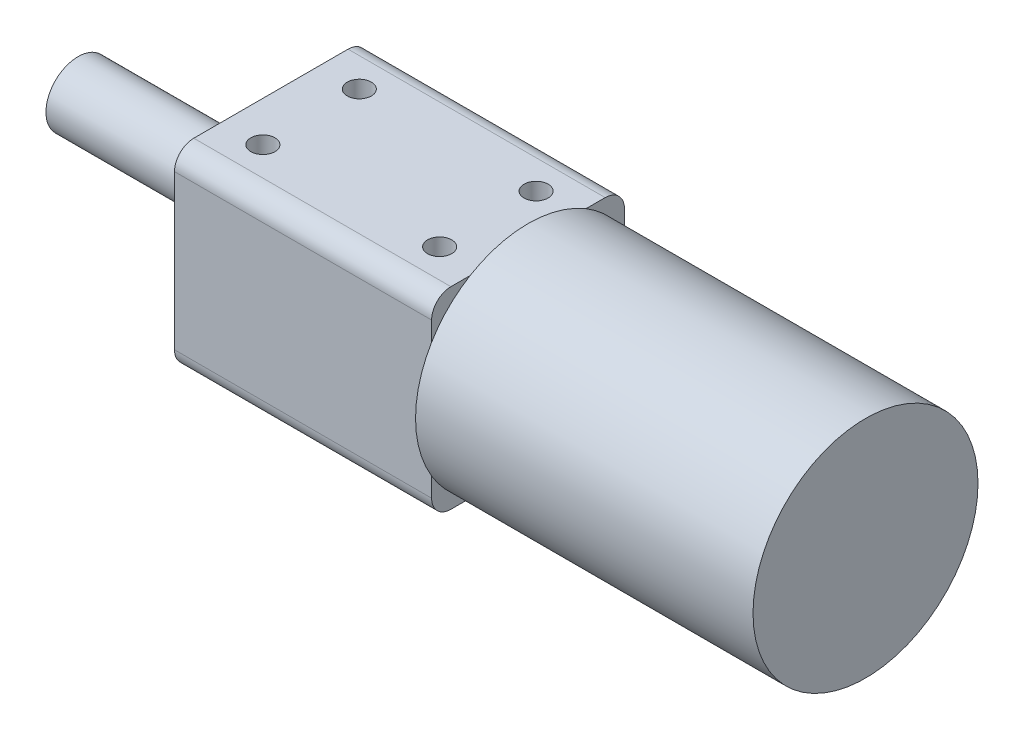
ISO-10303-21;
HEADER;
FILE_DESCRIPTION(('STEP AP214'),'2;1');
FILE_NAME('part.step','',(''),(''),'','','');
FILE_SCHEMA(('AUTOMOTIVE_DESIGN { 1 0 10303 214 1 1 1 1 }'));
ENDSEC;
DATA;
#1=APPLICATION_CONTEXT('core data for automotive mechanical design processes');
#2=APPLICATION_PROTOCOL_DEFINITION('international standard','automotive_design',2000,#1);
#3=PRODUCT_CONTEXT('',#1,'mechanical');
#4=PRODUCT('Part','Part','',(#3));
#5=PRODUCT_RELATED_PRODUCT_CATEGORY('part','',(#4));
#6=PRODUCT_DEFINITION_FORMATION('','',#4);
#7=PRODUCT_DEFINITION_CONTEXT('part definition',#1,'design');
#8=PRODUCT_DEFINITION('design','',#6,#7);
#9=PRODUCT_DEFINITION_SHAPE('','',#8);
#10=(LENGTH_UNIT() NAMED_UNIT(*) SI_UNIT(.MILLI.,.METRE.));
#11=(NAMED_UNIT(*) PLANE_ANGLE_UNIT() SI_UNIT($,.RADIAN.));
#12=(NAMED_UNIT(*) SI_UNIT($,.STERADIAN.) SOLID_ANGLE_UNIT());
#13=UNCERTAINTY_MEASURE_WITH_UNIT(LENGTH_MEASURE(1.E-05),#10,'distance_accuracy_value','');
#14=(GEOMETRIC_REPRESENTATION_CONTEXT(3) GLOBAL_UNCERTAINTY_ASSIGNED_CONTEXT((#13)) GLOBAL_UNIT_ASSIGNED_CONTEXT((#10,
#11,#12)) REPRESENTATION_CONTEXT('',''));
#15=CARTESIAN_POINT('',(0.,0.,0.));
#16=DIRECTION('',(0.,0.,1.));
#17=DIRECTION('',(1.,0.,0.));
#18=AXIS2_PLACEMENT_3D('',#15,#16,#17);
#19=CARTESIAN_POINT('',(0.,0.,0.));
#20=DIRECTION('',(1.,0.,0.));
#21=DIRECTION('',(0.,0.,-1.));
#22=AXIS2_PLACEMENT_3D('',#19,#20,#21);
#23=PLANE('',#22);
#24=DIRECTION('',(0.,0.,-1.));
#25=VECTOR('',#24,1.);
#26=CARTESIAN_POINT('',(0.,19.05,0.));
#27=LINE('',#26,#25);
#28=CARTESIAN_POINT('',(0.,19.05,11.4476252995982));
#29=VERTEX_POINT('',#28);
#30=CARTESIAN_POINT('',(0.,19.05,-11.4476252995982));
#31=VERTEX_POINT('',#30);
#32=EDGE_CURVE('E132',#29,#31,#27,.T.);
#33=ORIENTED_EDGE('',*,*,#32,.F.);
#34=CARTESIAN_POINT('',(0.,0.,0.));
#35=DIRECTION('',(1.,0.,0.));
#36=DIRECTION('',(0.,0.,-1.));
#37=AXIS2_PLACEMENT_3D('',#34,#35,#36);
#38=CIRCLE('',#37,22.225);
#39=EDGE_CURVE('E147',#31,#29,#38,.T.);
#40=ORIENTED_EDGE('',*,*,#39,.F.);
#41=EDGE_LOOP('',(#33,#40));
#42=FACE_BOUND('',#41,.T.);
#43=ADVANCED_FACE('F39',(#42),#23,.F.);
#44=DIRECTION('',(0.,1.,0.));
#45=VECTOR('',#44,1.);
#46=CARTESIAN_POINT('',(0.,0.,19.05));
#47=LINE('',#46,#45);
#48=CARTESIAN_POINT('',(0.,-11.4476252995982,19.05));
#49=VERTEX_POINT('',#48);
#50=CARTESIAN_POINT('',(0.,11.4476252995982,19.05));
#51=VERTEX_POINT('',#50);
#52=EDGE_CURVE('E153',#49,#51,#47,.T.);
#53=ORIENTED_EDGE('',*,*,#52,.F.);
#54=EDGE_CURVE('E148',#51,#49,#38,.T.);
#55=ORIENTED_EDGE('',*,*,#54,.F.);
#56=EDGE_LOOP('',(#53,#55));
#57=FACE_BOUND('',#56,.T.);
#58=ADVANCED_FACE('F216',(#57),#23,.F.);
#59=CARTESIAN_POINT('',(0.,-19.05,11.4476252995982));
#60=VERTEX_POINT('',#59);
#61=CARTESIAN_POINT('',(0.,-19.05,-11.4476252995982));
#62=VERTEX_POINT('',#61);
#63=EDGE_CURVE('E248',#60,#62,#38,.T.);
#64=ORIENTED_EDGE('',*,*,#63,.F.);
#65=DIRECTION('',(0.,0.,-1.));
#66=VECTOR('',#65,1.);
#67=CARTESIAN_POINT('',(0.,-19.05,0.));
#68=LINE('',#67,#66);
#69=EDGE_CURVE('E251',#60,#62,#68,.T.);
#70=ORIENTED_EDGE('',*,*,#69,.T.);
#71=EDGE_LOOP('',(#64,#70));
#72=FACE_BOUND('',#71,.T.);
#73=ADVANCED_FACE('F222',(#72),#23,.F.);
#74=CARTESIAN_POINT('',(66.675,0.,0.));
#75=DIRECTION('',(-1.,0.,0.));
#76=DIRECTION('',(0.,0.,1.));
#77=AXIS2_PLACEMENT_3D('',#74,#75,#76);
#78=CYLINDRICAL_SURFACE('',#77,22.225);
#79=CARTESIAN_POINT('',(66.675,0.,0.));
#80=DIRECTION('',(1.,0.,0.));
#81=DIRECTION('',(0.,0.,-1.));
#82=AXIS2_PLACEMENT_3D('',#79,#80,#81);
#83=CIRCLE('',#82,22.225);
#84=CARTESIAN_POINT('',(66.675,0.,-22.225));
#85=VERTEX_POINT('',#84);
#86=EDGE_CURVE('E158',#85,#85,#83,.T.);
#87=ORIENTED_EDGE('',*,*,#86,.F.);
#88=EDGE_LOOP('',(#87));
#89=FACE_BOUND('',#88,.T.);
#90=CARTESIAN_POINT('',(0.,11.4476252995982,-19.05));
#91=VERTEX_POINT('',#90);
#92=EDGE_CURVE('E157',#91,#31,#38,.T.);
#93=ORIENTED_EDGE('',*,*,#92,.T.);
#94=ORIENTED_EDGE('',*,*,#39,.T.);
#95=EDGE_CURVE('E141',#29,#51,#38,.T.);
#96=ORIENTED_EDGE('',*,*,#95,.T.);
#97=ORIENTED_EDGE('',*,*,#54,.T.);
#98=EDGE_CURVE('E253',#49,#60,#38,.T.);
#99=ORIENTED_EDGE('',*,*,#98,.T.);
#100=ORIENTED_EDGE('',*,*,#63,.T.);
#101=CARTESIAN_POINT('',(0.,-11.4476252995982,-19.05));
#102=VERTEX_POINT('',#101);
#103=EDGE_CURVE('E254',#62,#102,#38,.T.);
#104=ORIENTED_EDGE('',*,*,#103,.T.);
#105=EDGE_CURVE('E159',#102,#91,#38,.T.);
#106=ORIENTED_EDGE('',*,*,#105,.T.);
#107=EDGE_LOOP('',(#93,#94,#96,#97,#99,#100,#104,#106));
#108=FACE_BOUND('',#107,.T.);
#109=ADVANCED_FACE('F154',(#89,#108),#78,.T.);
#110=CARTESIAN_POINT('',(66.675,0.,0.));
#111=DIRECTION('',(1.,0.,0.));
#112=DIRECTION('',(0.,0.,-1.));
#113=AXIS2_PLACEMENT_3D('',#110,#111,#112);
#114=PLANE('',#113);
#115=ORIENTED_EDGE('',*,*,#86,.T.);
#116=EDGE_LOOP('',(#115));
#117=FACE_BOUND('',#116,.T.);
#118=ADVANCED_FACE('F228',(#117),#114,.T.);
#119=ORIENTED_EDGE('',*,*,#105,.F.);
#120=DIRECTION('',(0.,1.,0.));
#121=VECTOR('',#120,1.);
#122=CARTESIAN_POINT('',(0.,0.,-19.05));
#123=LINE('',#122,#121);
#124=EDGE_CURVE('E265',#102,#91,#123,.T.);
#125=ORIENTED_EDGE('',*,*,#124,.T.);
#126=EDGE_LOOP('',(#119,#125));
#127=FACE_BOUND('',#126,.T.);
#128=ADVANCED_FACE('F218',(#127),#23,.F.);
#129=CARTESIAN_POINT('',(0.,0.,0.));
#130=DIRECTION('',(1.,0.,0.));
#131=DIRECTION('',(0.,0.,-1.));
#132=AXIS2_PLACEMENT_3D('',#129,#130,#131);
#133=PLANE('',#132);
#134=CARTESIAN_POINT('',(0.,15.24,-19.05));
#135=VERTEX_POINT('',#134);
#136=EDGE_CURVE('E271',#91,#135,#123,.T.);
#137=ORIENTED_EDGE('',*,*,#136,.T.);
#138=CARTESIAN_POINT('',(0.,15.24,-15.24));
#139=DIRECTION('',(1.,0.,0.));
#140=DIRECTION('',(0.,0.,-1.));
#141=AXIS2_PLACEMENT_3D('',#138,#139,#140);
#142=CIRCLE('',#141,3.81);
#143=CARTESIAN_POINT('',(0.,19.05,-15.24));
#144=VERTEX_POINT('',#143);
#145=EDGE_CURVE('E167',#135,#144,#142,.T.);
#146=ORIENTED_EDGE('',*,*,#145,.T.);
#147=EDGE_CURVE('E138',#31,#144,#27,.T.);
#148=ORIENTED_EDGE('',*,*,#147,.F.);
#149=ORIENTED_EDGE('',*,*,#92,.F.);
#150=EDGE_LOOP('',(#137,#146,#148,#149));
#151=FACE_BOUND('',#150,.T.);
#152=ADVANCED_FACE('F227',(#151),#133,.T.);
#153=CARTESIAN_POINT('',(0.,19.05,15.24));
#154=VERTEX_POINT('',#153);
#155=EDGE_CURVE('E127',#154,#29,#27,.T.);
#156=ORIENTED_EDGE('',*,*,#155,.F.);
#157=CARTESIAN_POINT('',(0.,15.24,15.24));
#158=DIRECTION('',(1.,0.,0.));
#159=DIRECTION('',(0.,0.,-1.));
#160=AXIS2_PLACEMENT_3D('',#157,#158,#159);
#161=CIRCLE('',#160,3.81);
#162=CARTESIAN_POINT('',(0.,15.24,19.05));
#163=VERTEX_POINT('',#162);
#164=EDGE_CURVE('E60',#154,#163,#161,.T.);
#165=ORIENTED_EDGE('',*,*,#164,.T.);
#166=EDGE_CURVE('E137',#51,#163,#47,.T.);
#167=ORIENTED_EDGE('',*,*,#166,.F.);
#168=ORIENTED_EDGE('',*,*,#95,.F.);
#169=EDGE_LOOP('',(#156,#165,#167,#168));
#170=FACE_BOUND('',#169,.T.);
#171=ADVANCED_FACE('F142',(#170),#133,.T.);
#172=CARTESIAN_POINT('',(0.,-15.24,19.05));
#173=VERTEX_POINT('',#172);
#174=EDGE_CURVE('E261',#173,#49,#47,.T.);
#175=ORIENTED_EDGE('',*,*,#174,.F.);
#176=CARTESIAN_POINT('',(0.,-15.24,15.24));
#177=DIRECTION('',(1.,0.,0.));
#178=DIRECTION('',(0.,0.,-1.));
#179=AXIS2_PLACEMENT_3D('',#176,#177,#178);
#180=CIRCLE('',#179,3.81);
#181=CARTESIAN_POINT('',(0.,-19.05,15.24));
#182=VERTEX_POINT('',#181);
#183=EDGE_CURVE('E12',#173,#182,#180,.T.);
#184=ORIENTED_EDGE('',*,*,#183,.T.);
#185=EDGE_CURVE('E263',#182,#60,#68,.T.);
#186=ORIENTED_EDGE('',*,*,#185,.T.);
#187=ORIENTED_EDGE('',*,*,#98,.F.);
#188=EDGE_LOOP('',(#175,#184,#186,#187));
#189=FACE_BOUND('',#188,.T.);
#190=ADVANCED_FACE('F260',(#189),#133,.T.);
#191=CARTESIAN_POINT('',(0.,-19.05,-15.24));
#192=VERTEX_POINT('',#191);
#193=EDGE_CURVE('E267',#62,#192,#68,.T.);
#194=ORIENTED_EDGE('',*,*,#193,.T.);
#195=CARTESIAN_POINT('',(0.,-15.24,-15.24));
#196=DIRECTION('',(1.,0.,0.));
#197=DIRECTION('',(0.,0.,-1.));
#198=AXIS2_PLACEMENT_3D('',#195,#196,#197);
#199=CIRCLE('',#198,3.81);
#200=CARTESIAN_POINT('',(0.,-15.24,-19.05));
#201=VERTEX_POINT('',#200);
#202=EDGE_CURVE('E185',#192,#201,#199,.T.);
#203=ORIENTED_EDGE('',*,*,#202,.T.);
#204=EDGE_CURVE('E272',#201,#102,#123,.T.);
#205=ORIENTED_EDGE('',*,*,#204,.T.);
#206=ORIENTED_EDGE('',*,*,#103,.F.);
#207=EDGE_LOOP('',(#194,#203,#205,#206));
#208=FACE_BOUND('',#207,.T.);
#209=ADVANCED_FACE('F236',(#208),#133,.T.);
#210=CARTESIAN_POINT('',(-50.8,19.05,0.));
#211=DIRECTION('',(0.,-1.,0.));
#212=DIRECTION('',(0.,0.,-1.));
#213=AXIS2_PLACEMENT_3D('',#210,#211,#212);
#214=PLANE('',#213);
#215=CARTESIAN_POINT('',(-42.8625,19.05,9.525));
#216=DIRECTION('',(0.,1.,0.));
#217=DIRECTION('',(0.,0.,-1.));
#218=AXIS2_PLACEMENT_3D('',#215,#216,#217);
#219=CIRCLE('',#218,2.38125);
#220=CARTESIAN_POINT('',(-42.8625,19.05,7.14375));
#221=VERTEX_POINT('',#220);
#222=EDGE_CURVE('E302',#221,#221,#219,.T.);
#223=ORIENTED_EDGE('',*,*,#222,.F.);
#224=EDGE_LOOP('',(#223));
#225=FACE_BOUND('',#224,.T.);
#226=CARTESIAN_POINT('',(-7.9375,19.05,9.525));
#227=DIRECTION('',(0.,1.,0.));
#228=DIRECTION('',(0.,0.,-1.));
#229=AXIS2_PLACEMENT_3D('',#226,#227,#228);
#230=CIRCLE('',#229,2.38125);
#231=CARTESIAN_POINT('',(-7.9375,19.05,7.14375));
#232=VERTEX_POINT('',#231);
#233=EDGE_CURVE('E309',#232,#232,#230,.T.);
#234=ORIENTED_EDGE('',*,*,#233,.F.);
#235=EDGE_LOOP('',(#234));
#236=FACE_BOUND('',#235,.T.);
#237=CARTESIAN_POINT('',(-7.9375,19.05,-9.525));
#238=DIRECTION('',(0.,1.,0.));
#239=DIRECTION('',(0.,0.,1.));
#240=AXIS2_PLACEMENT_3D('',#237,#238,#239);
#241=CIRCLE('',#240,2.38125);
#242=CARTESIAN_POINT('',(-7.9375,19.05,-7.14375));
#243=VERTEX_POINT('',#242);
#244=EDGE_CURVE('E315',#243,#243,#241,.T.);
#245=ORIENTED_EDGE('',*,*,#244,.F.);
#246=EDGE_LOOP('',(#245));
#247=FACE_BOUND('',#246,.T.);
#248=CARTESIAN_POINT('',(-42.8625,19.05,-9.525));
#249=DIRECTION('',(0.,1.,0.));
#250=DIRECTION('',(0.,0.,1.));
#251=AXIS2_PLACEMENT_3D('',#248,#249,#250);
#252=CIRCLE('',#251,2.38125);
#253=CARTESIAN_POINT('',(-42.8625,19.05,-7.14375));
#254=VERTEX_POINT('',#253);
#255=EDGE_CURVE('E296',#254,#254,#252,.T.);
#256=ORIENTED_EDGE('',*,*,#255,.F.);
#257=EDGE_LOOP('',(#256));
#258=FACE_BOUND('',#257,.T.);
#259=ORIENTED_EDGE('',*,*,#147,.T.);
#260=DIRECTION('',(1.,0.,0.));
#261=VECTOR('',#260,1.);
#262=CARTESIAN_POINT('',(-50.8,19.05,-15.24));
#263=LINE('',#262,#261);
#264=CARTESIAN_POINT('',(-50.8,19.05,-15.24));
#265=VERTEX_POINT('',#264);
#266=EDGE_CURVE('E170',#144,#265,#263,.F.);
#267=ORIENTED_EDGE('',*,*,#266,.T.);
#268=DIRECTION('',(0.,0.,-1.));
#269=VECTOR('',#268,1.);
#270=CARTESIAN_POINT('',(-50.8,19.05,0.));
#271=LINE('',#270,#269);
#272=CARTESIAN_POINT('',(-50.8,19.05,15.24));
#273=VERTEX_POINT('',#272);
#274=EDGE_CURVE('E203',#273,#265,#271,.T.);
#275=ORIENTED_EDGE('',*,*,#274,.F.);
#276=DIRECTION('',(1.,0.,0.));
#277=VECTOR('',#276,1.);
#278=CARTESIAN_POINT('',(-50.8,19.05,15.24));
#279=LINE('',#278,#277);
#280=EDGE_CURVE('E136',#273,#154,#279,.T.);
#281=ORIENTED_EDGE('',*,*,#280,.T.);
#282=ORIENTED_EDGE('',*,*,#155,.T.);
#283=ORIENTED_EDGE('',*,*,#32,.T.);
#284=EDGE_LOOP('',(#259,#267,#275,#281,#282,#283));
#285=FACE_BOUND('',#284,.T.);
#286=ADVANCED_FACE('F130',(#225,#236,#247,#258,#285),#214,.F.);
#287=CARTESIAN_POINT('',(-50.8,0.,-19.05));
#288=DIRECTION('',(0.,0.,-1.));
#289=DIRECTION('',(-1.,0.,0.));
#290=AXIS2_PLACEMENT_3D('',#287,#288,#289);
#291=PLANE('',#290);
#292=DIRECTION('',(0.,1.,0.));
#293=VECTOR('',#292,1.);
#294=CARTESIAN_POINT('',(-50.8,0.,-19.05));
#295=LINE('',#294,#293);
#296=CARTESIAN_POINT('',(-50.8,-15.24,-19.05));
#297=VERTEX_POINT('',#296);
#298=CARTESIAN_POINT('',(-50.8,15.24,-19.05));
#299=VERTEX_POINT('',#298);
#300=EDGE_CURVE('E281',#297,#299,#295,.T.);
#301=ORIENTED_EDGE('',*,*,#300,.T.);
#302=DIRECTION('',(1.,0.,0.));
#303=VECTOR('',#302,1.);
#304=CARTESIAN_POINT('',(0.,15.24,-19.05));
#305=LINE('',#304,#303);
#306=EDGE_CURVE('E164',#299,#135,#305,.T.);
#307=ORIENTED_EDGE('',*,*,#306,.T.);
#308=ORIENTED_EDGE('',*,*,#136,.F.);
#309=ORIENTED_EDGE('',*,*,#124,.F.);
#310=ORIENTED_EDGE('',*,*,#204,.F.);
#311=DIRECTION('',(1.,0.,0.));
#312=VECTOR('',#311,1.);
#313=CARTESIAN_POINT('',(-50.8,-15.24,-19.05));
#314=LINE('',#313,#312);
#315=EDGE_CURVE('E152',#201,#297,#314,.F.);
#316=ORIENTED_EDGE('',*,*,#315,.T.);
#317=EDGE_LOOP('',(#301,#307,#308,#309,#310,#316));
#318=FACE_BOUND('',#317,.T.);
#319=ADVANCED_FACE('F356',(#318),#291,.T.);
#320=CARTESIAN_POINT('',(-50.8,-19.05,0.));
#321=DIRECTION('',(0.,-1.,0.));
#322=DIRECTION('',(0.,0.,-1.));
#323=AXIS2_PLACEMENT_3D('',#320,#321,#322);
#324=PLANE('',#323);
#325=CARTESIAN_POINT('',(-42.8625,-19.05,9.525));
#326=DIRECTION('',(0.,-1.,0.));
#327=DIRECTION('',(0.,0.,-1.));
#328=AXIS2_PLACEMENT_3D('',#325,#326,#327);
#329=CIRCLE('',#328,2.38125);
#330=CARTESIAN_POINT('',(-42.8625,-19.05,7.14375));
#331=VERTEX_POINT('',#330);
#332=EDGE_CURVE('E326',#331,#331,#329,.T.);
#333=ORIENTED_EDGE('',*,*,#332,.F.);
#334=EDGE_LOOP('',(#333));
#335=FACE_BOUND('',#334,.T.);
#336=CARTESIAN_POINT('',(-7.9375,-19.05,9.525));
#337=DIRECTION('',(0.,-1.,0.));
#338=DIRECTION('',(0.,0.,-1.));
#339=AXIS2_PLACEMENT_3D('',#336,#337,#338);
#340=CIRCLE('',#339,2.38125);
#341=CARTESIAN_POINT('',(-7.9375,-19.05,7.14375));
#342=VERTEX_POINT('',#341);
#343=EDGE_CURVE('E332',#342,#342,#340,.T.);
#344=ORIENTED_EDGE('',*,*,#343,.F.);
#345=EDGE_LOOP('',(#344));
#346=FACE_BOUND('',#345,.T.);
#347=CARTESIAN_POINT('',(-7.9375,-19.05,-9.525));
#348=DIRECTION('',(0.,-1.,0.));
#349=DIRECTION('',(0.,0.,-1.));
#350=AXIS2_PLACEMENT_3D('',#347,#348,#349);
#351=CIRCLE('',#350,2.38125);
#352=CARTESIAN_POINT('',(-7.9375,-19.05,-11.90625));
#353=VERTEX_POINT('',#352);
#354=EDGE_CURVE('E338',#353,#353,#351,.T.);
#355=ORIENTED_EDGE('',*,*,#354,.F.);
#356=EDGE_LOOP('',(#355));
#357=FACE_BOUND('',#356,.T.);
#358=CARTESIAN_POINT('',(-42.8625,-19.05,-9.525));
#359=DIRECTION('',(0.,-1.,0.));
#360=DIRECTION('',(0.,0.,-1.));
#361=AXIS2_PLACEMENT_3D('',#358,#359,#360);
#362=CIRCLE('',#361,2.38125);
#363=CARTESIAN_POINT('',(-42.8625,-19.05,-11.90625));
#364=VERTEX_POINT('',#363);
#365=EDGE_CURVE('E320',#364,#364,#362,.T.);
#366=ORIENTED_EDGE('',*,*,#365,.F.);
#367=EDGE_LOOP('',(#366));
#368=FACE_BOUND('',#367,.T.);
#369=DIRECTION('',(0.,0.,-1.));
#370=VECTOR('',#369,1.);
#371=CARTESIAN_POINT('',(-50.8,-19.05,0.));
#372=LINE('',#371,#370);
#373=CARTESIAN_POINT('',(-50.8,-19.05,15.24));
#374=VERTEX_POINT('',#373);
#375=CARTESIAN_POINT('',(-50.8,-19.05,-15.24));
#376=VERTEX_POINT('',#375);
#377=EDGE_CURVE('E202',#374,#376,#372,.T.);
#378=ORIENTED_EDGE('',*,*,#377,.T.);
#379=DIRECTION('',(1.,0.,0.));
#380=VECTOR('',#379,1.);
#381=CARTESIAN_POINT('',(-50.8,-19.05,-15.24));
#382=LINE('',#381,#380);
#383=EDGE_CURVE('E182',#376,#192,#382,.T.);
#384=ORIENTED_EDGE('',*,*,#383,.T.);
#385=ORIENTED_EDGE('',*,*,#193,.F.);
#386=ORIENTED_EDGE('',*,*,#69,.F.);
#387=ORIENTED_EDGE('',*,*,#185,.F.);
#388=DIRECTION('',(1.,0.,0.));
#389=VECTOR('',#388,1.);
#390=CARTESIAN_POINT('',(-50.8,-19.05,15.24));
#391=LINE('',#390,#389);
#392=EDGE_CURVE('E180',#182,#374,#391,.F.);
#393=ORIENTED_EDGE('',*,*,#392,.T.);
#394=EDGE_LOOP('',(#378,#384,#385,#386,#387,#393));
#395=FACE_BOUND('',#394,.T.);
#396=ADVANCED_FACE('F353',(#335,#346,#357,#368,#395),#324,.T.);
#397=CARTESIAN_POINT('',(-50.8,0.,19.05));
#398=DIRECTION('',(0.,0.,-1.));
#399=DIRECTION('',(-1.,0.,0.));
#400=AXIS2_PLACEMENT_3D('',#397,#398,#399);
#401=PLANE('',#400);
#402=ORIENTED_EDGE('',*,*,#166,.T.);
#403=DIRECTION('',(1.,0.,0.));
#404=VECTOR('',#403,1.);
#405=CARTESIAN_POINT('',(-50.8,15.24,19.05));
#406=LINE('',#405,#404);
#407=CARTESIAN_POINT('',(-50.8,15.24,19.05));
#408=VERTEX_POINT('',#407);
#409=EDGE_CURVE('E47',#163,#408,#406,.F.);
#410=ORIENTED_EDGE('',*,*,#409,.T.);
#411=DIRECTION('',(0.,1.,0.));
#412=VECTOR('',#411,1.);
#413=CARTESIAN_POINT('',(-50.8,0.,19.05));
#414=LINE('',#413,#412);
#415=CARTESIAN_POINT('',(-50.8,-15.24,19.05));
#416=VERTEX_POINT('',#415);
#417=EDGE_CURVE('E194',#416,#408,#414,.T.);
#418=ORIENTED_EDGE('',*,*,#417,.F.);
#419=DIRECTION('',(1.,0.,0.));
#420=VECTOR('',#419,1.);
#421=CARTESIAN_POINT('',(0.,-15.24,19.05));
#422=LINE('',#421,#420);
#423=EDGE_CURVE('E188',#416,#173,#422,.T.);
#424=ORIENTED_EDGE('',*,*,#423,.T.);
#425=ORIENTED_EDGE('',*,*,#174,.T.);
#426=ORIENTED_EDGE('',*,*,#52,.T.);
#427=EDGE_LOOP('',(#402,#410,#418,#424,#425,#426));
#428=FACE_BOUND('',#427,.T.);
#429=ADVANCED_FACE('F193',(#428),#401,.F.);
#430=CARTESIAN_POINT('',(-50.8,0.,0.));
#431=DIRECTION('',(1.,0.,0.));
#432=DIRECTION('',(0.,0.,-1.));
#433=AXIS2_PLACEMENT_3D('',#430,#431,#432);
#434=PLANE('',#433);
#435=CARTESIAN_POINT('',(-50.8,0.,0.));
#436=DIRECTION('',(1.,0.,0.));
#437=DIRECTION('',(0.,0.,-1.));
#438=AXIS2_PLACEMENT_3D('',#435,#436,#437);
#439=CIRCLE('',#438,6.35);
#440=CARTESIAN_POINT('',(-50.8,0.,-6.35));
#441=VERTEX_POINT('',#440);
#442=EDGE_CURVE('E289',#441,#441,#439,.T.);
#443=ORIENTED_EDGE('',*,*,#442,.T.);
#444=EDGE_LOOP('',(#443));
#445=FACE_BOUND('',#444,.T.);
#446=ORIENTED_EDGE('',*,*,#274,.T.);
#447=CARTESIAN_POINT('',(-50.8,15.24,-15.24));
#448=DIRECTION('',(1.,0.,0.));
#449=DIRECTION('',(0.,0.,-1.));
#450=AXIS2_PLACEMENT_3D('',#447,#448,#449);
#451=CIRCLE('',#450,3.81);
#452=EDGE_CURVE('E178',#265,#299,#451,.F.);
#453=ORIENTED_EDGE('',*,*,#452,.T.);
#454=ORIENTED_EDGE('',*,*,#300,.F.);
#455=CARTESIAN_POINT('',(-50.8,-15.24,-15.24));
#456=DIRECTION('',(1.,0.,0.));
#457=DIRECTION('',(0.,0.,-1.));
#458=AXIS2_PLACEMENT_3D('',#455,#456,#457);
#459=CIRCLE('',#458,3.81);
#460=EDGE_CURVE('E176',#297,#376,#459,.F.);
#461=ORIENTED_EDGE('',*,*,#460,.T.);
#462=ORIENTED_EDGE('',*,*,#377,.F.);
#463=CARTESIAN_POINT('',(-50.8,-15.24,15.24));
#464=DIRECTION('',(1.,0.,0.));
#465=DIRECTION('',(0.,0.,-1.));
#466=AXIS2_PLACEMENT_3D('',#463,#464,#465);
#467=CIRCLE('',#466,3.81);
#468=EDGE_CURVE('E172',#374,#416,#467,.F.);
#469=ORIENTED_EDGE('',*,*,#468,.T.);
#470=ORIENTED_EDGE('',*,*,#417,.T.);
#471=CARTESIAN_POINT('',(-50.8,15.24,15.24));
#472=DIRECTION('',(1.,0.,0.));
#473=DIRECTION('',(0.,0.,-1.));
#474=AXIS2_PLACEMENT_3D('',#471,#472,#473);
#475=CIRCLE('',#474,3.81);
#476=EDGE_CURVE('E174',#408,#273,#475,.F.);
#477=ORIENTED_EDGE('',*,*,#476,.T.);
#478=EDGE_LOOP('',(#446,#453,#454,#461,#462,#469,#470,#477));
#479=FACE_BOUND('',#478,.T.);
#480=ADVANCED_FACE('F199',(#445,#479),#434,.F.);
#481=CARTESIAN_POINT('',(-88.9,0.,0.));
#482=DIRECTION('',(1.,0.,0.));
#483=DIRECTION('',(0.,0.,-1.));
#484=AXIS2_PLACEMENT_3D('',#481,#482,#483);
#485=CYLINDRICAL_SURFACE('',#484,6.35);
#486=CARTESIAN_POINT('',(-88.9,0.,0.));
#487=DIRECTION('',(1.,0.,0.));
#488=DIRECTION('',(0.,0.,-1.));
#489=AXIS2_PLACEMENT_3D('',#486,#487,#488);
#490=CIRCLE('',#489,6.35);
#491=CARTESIAN_POINT('',(-88.9,0.,-6.35));
#492=VERTEX_POINT('',#491);
#493=EDGE_CURVE('E292',#492,#492,#490,.T.);
#494=CARTESIAN_POINT('',(-88.9,0.,-6.35));
#495=CARTESIAN_POINT('',(-88.503125,0.,-6.35));
#496=CARTESIAN_POINT('',(-88.10625,0.,-6.35));
#497=CARTESIAN_POINT('',(-87.3125,0.,-6.35));
#498=CARTESIAN_POINT('',(-86.915625,0.,-6.35));
#499=CARTESIAN_POINT('',(-86.121875,0.,-6.35));
#500=CARTESIAN_POINT('',(-85.725,0.,-6.35));
#501=CARTESIAN_POINT('',(-84.93125,0.,-6.35));
#502=CARTESIAN_POINT('',(-84.534375,0.,-6.35));
#503=CARTESIAN_POINT('',(-83.740625,0.,-6.35));
#504=CARTESIAN_POINT('',(-83.34375,0.,-6.35));
#505=CARTESIAN_POINT('',(-82.55,0.,-6.35));
#506=CARTESIAN_POINT('',(-82.153125,0.,-6.35));
#507=CARTESIAN_POINT('',(-81.359375,0.,-6.35));
#508=CARTESIAN_POINT('',(-80.9625,0.,-6.35));
#509=CARTESIAN_POINT('',(-80.16875,0.,-6.35));
#510=CARTESIAN_POINT('',(-79.771875,0.,-6.35));
#511=CARTESIAN_POINT('',(-78.978125,0.,-6.35));
#512=CARTESIAN_POINT('',(-78.58125,0.,-6.35));
#513=CARTESIAN_POINT('',(-77.7875,0.,-6.35));
#514=CARTESIAN_POINT('',(-77.390625,0.,-6.35));
#515=CARTESIAN_POINT('',(-76.596875,0.,-6.35));
#516=CARTESIAN_POINT('',(-76.2,0.,-6.35));
#517=CARTESIAN_POINT('',(-75.40625,0.,-6.35));
#518=CARTESIAN_POINT('',(-75.009375,0.,-6.35));
#519=CARTESIAN_POINT('',(-74.215625,0.,-6.35));
#520=CARTESIAN_POINT('',(-73.81875,0.,-6.35));
#521=CARTESIAN_POINT('',(-73.025,0.,-6.35));
#522=CARTESIAN_POINT('',(-72.628125,0.,-6.35));
#523=CARTESIAN_POINT('',(-71.834375,0.,-6.35));
#524=CARTESIAN_POINT('',(-71.4375,0.,-6.35));
#525=CARTESIAN_POINT('',(-70.64375,0.,-6.35));
#526=CARTESIAN_POINT('',(-70.246875,0.,-6.35));
#527=CARTESIAN_POINT('',(-69.453125,0.,-6.35));
#528=CARTESIAN_POINT('',(-69.05625,0.,-6.35));
#529=CARTESIAN_POINT('',(-68.2625,0.,-6.35));
#530=CARTESIAN_POINT('',(-67.865625,0.,-6.35));
#531=CARTESIAN_POINT('',(-67.071875,0.,-6.35));
#532=CARTESIAN_POINT('',(-66.675,0.,-6.35));
#533=CARTESIAN_POINT('',(-65.88125,0.,-6.35));
#534=CARTESIAN_POINT('',(-65.484375,0.,-6.35));
#535=CARTESIAN_POINT('',(-64.690625,0.,-6.35));
#536=CARTESIAN_POINT('',(-64.29375,0.,-6.35));
#537=CARTESIAN_POINT('',(-63.5,0.,-6.35));
#538=CARTESIAN_POINT('',(-63.103125,0.,-6.35));
#539=CARTESIAN_POINT('',(-62.309375,0.,-6.35));
#540=CARTESIAN_POINT('',(-61.9125,0.,-6.35));
#541=CARTESIAN_POINT('',(-61.11875,0.,-6.35));
#542=CARTESIAN_POINT('',(-60.721875,0.,-6.35));
#543=CARTESIAN_POINT('',(-59.928125,0.,-6.35));
#544=CARTESIAN_POINT('',(-59.53125,0.,-6.35));
#545=CARTESIAN_POINT('',(-58.7375,0.,-6.35));
#546=CARTESIAN_POINT('',(-58.340625,0.,-6.35));
#547=CARTESIAN_POINT('',(-57.546875,0.,-6.35));
#548=CARTESIAN_POINT('',(-57.15,0.,-6.35));
#549=CARTESIAN_POINT('',(-56.35625,0.,-6.35));
#550=CARTESIAN_POINT('',(-55.959375,0.,-6.35));
#551=CARTESIAN_POINT('',(-55.165625,0.,-6.35));
#552=CARTESIAN_POINT('',(-54.76875,0.,-6.35));
#553=CARTESIAN_POINT('',(-53.975,0.,-6.35));
#554=CARTESIAN_POINT('',(-53.578125,0.,-6.35));
#555=CARTESIAN_POINT('',(-52.784375,0.,-6.35));
#556=CARTESIAN_POINT('',(-52.3875,0.,-6.35));
#557=CARTESIAN_POINT('',(-51.59375,0.,-6.35));
#558=CARTESIAN_POINT('',(-51.196875,0.,-6.35));
#559=CARTESIAN_POINT('',(-50.8,0.,-6.35));
#560=B_SPLINE_CURVE_WITH_KNOTS('',3,(#494,#495,#496,#497,#498,#499,#500,#501,#502,#503,#504,
#505,#506,#507,#508,#509,#510,#511,#512,#513,#514,#515,#516,#517,#518,#519,#520,#521,#522,#523,
#524,#525,#526,#527,#528,#529,#530,#531,#532,#533,#534,#535,#536,#537,#538,#539,#540,#541,#542,
#543,#544,#545,#546,#547,#548,#549,#550,#551,#552,#553,#554,#555,#556,#557,#558,#559),
.UNSPECIFIED.,.F.,.F.,(4,2,2,2,2,2,2,2,2,2,2,2,2,2,2,2,2,2,2,2,2,2,2,2,2,2,2,2,2,2,2,2,4),(0.,
1.190625,2.38125,3.571875,4.7625,5.953125,7.14375,8.334375,9.52500000000001,10.715625,11.90625,
13.096875,14.2875,15.478125,16.66875,17.859375,19.05,20.240625,21.43125,22.621875,23.8125,
25.003125,26.19375,27.384375,28.575,29.765625,30.95625,32.146875,33.3375,34.528125,35.71875,
36.909375,38.1),.UNSPECIFIED.);
#561=EDGE_CURVE('BSEAM428',#492,#441,#560,.T.);
#562=ORIENTED_EDGE('',*,*,#493,.T.);
#563=ORIENTED_EDGE('',*,*,#442,.F.);
#564=ORIENTED_EDGE('',*,*,#561,.T.);
#565=ORIENTED_EDGE('',*,*,#561,.F.);
#566=EDGE_LOOP('',(#562,#564,#563,#565));
#567=FACE_BOUND('',#566,.T.);
#568=ADVANCED_FACE('F428',(#567),#485,.T.);
#569=CARTESIAN_POINT('',(-88.9,0.,0.));
#570=DIRECTION('',(1.,0.,0.));
#571=DIRECTION('',(0.,0.,-1.));
#572=AXIS2_PLACEMENT_3D('',#569,#570,#571);
#573=PLANE('',#572);
#574=ORIENTED_EDGE('',*,*,#493,.F.);
#575=EDGE_LOOP('',(#574));
#576=FACE_BOUND('',#575,.T.);
#577=ADVANCED_FACE('F424',(#576),#573,.F.);
#578=CARTESIAN_POINT('',(-42.8625,6.35,-9.525));
#579=DIRECTION('',(0.,1.,0.));
#580=DIRECTION('',(0.,0.,1.));
#581=AXIS2_PLACEMENT_3D('',#578,#579,#580);
#582=CYLINDRICAL_SURFACE('',#581,2.38125);
#583=CARTESIAN_POINT('',(-42.8625,6.35,-9.525));
#584=DIRECTION('',(0.,1.,0.));
#585=DIRECTION('',(0.,0.,1.));
#586=AXIS2_PLACEMENT_3D('',#583,#584,#585);
#587=CIRCLE('',#586,2.38125);
#588=CARTESIAN_POINT('',(-42.8625,6.35,-7.14375));
#589=VERTEX_POINT('',#588);
#590=EDGE_CURVE('E293',#589,#589,#587,.T.);
#591=ORIENTED_EDGE('',*,*,#590,.F.);
#592=EDGE_LOOP('',(#591));
#593=FACE_BOUND('',#592,.T.);
#594=ORIENTED_EDGE('',*,*,#255,.T.);
#595=EDGE_LOOP('',(#594));
#596=FACE_BOUND('',#595,.T.);
#597=ADVANCED_FACE('F420',(#593,#596),#582,.F.);
#598=CARTESIAN_POINT('',(-42.8625,6.35,-9.525));
#599=DIRECTION('',(0.,1.,0.));
#600=DIRECTION('',(0.,0.,1.));
#601=AXIS2_PLACEMENT_3D('',#598,#599,#600);
#602=PLANE('',#601);
#603=ORIENTED_EDGE('',*,*,#590,.T.);
#604=EDGE_LOOP('',(#603));
#605=FACE_BOUND('',#604,.T.);
#606=ADVANCED_FACE('F402',(#605),#602,.T.);
#607=CARTESIAN_POINT('',(-7.9375,6.35,-9.525));
#608=DIRECTION('',(0.,1.,0.));
#609=DIRECTION('',(0.,0.,1.));
#610=AXIS2_PLACEMENT_3D('',#607,#608,#609);
#611=CYLINDRICAL_SURFACE('',#610,2.38125);
#612=CARTESIAN_POINT('',(-7.9375,6.35,-9.525));
#613=DIRECTION('',(0.,1.,0.));
#614=DIRECTION('',(0.,0.,1.));
#615=AXIS2_PLACEMENT_3D('',#612,#613,#614);
#616=CIRCLE('',#615,2.38125);
#617=CARTESIAN_POINT('',(-7.9375,6.35,-7.14375));
#618=VERTEX_POINT('',#617);
#619=EDGE_CURVE('E299',#618,#618,#616,.T.);
#620=ORIENTED_EDGE('',*,*,#619,.F.);
#621=EDGE_LOOP('',(#620));
#622=FACE_BOUND('',#621,.T.);
#623=ORIENTED_EDGE('',*,*,#244,.T.);
#624=EDGE_LOOP('',(#623));
#625=FACE_BOUND('',#624,.T.);
#626=ADVANCED_FACE('F398',(#622,#625),#611,.F.);
#627=CARTESIAN_POINT('',(-7.9375,6.35,-9.525));
#628=DIRECTION('',(0.,1.,0.));
#629=DIRECTION('',(0.,0.,1.));
#630=AXIS2_PLACEMENT_3D('',#627,#628,#629);
#631=PLANE('',#630);
#632=ORIENTED_EDGE('',*,*,#619,.T.);
#633=EDGE_LOOP('',(#632));
#634=FACE_BOUND('',#633,.T.);
#635=ADVANCED_FACE('F394',(#634),#631,.T.);
#636=CARTESIAN_POINT('',(-7.9375,6.35,9.525));
#637=DIRECTION('',(0.,1.,0.));
#638=DIRECTION('',(0.,0.,1.));
#639=AXIS2_PLACEMENT_3D('',#636,#637,#638);
#640=CYLINDRICAL_SURFACE('',#639,2.38125);
#641=CARTESIAN_POINT('',(-7.9375,6.35,9.525));
#642=DIRECTION('',(0.,1.,0.));
#643=DIRECTION('',(0.,0.,-1.));
#644=AXIS2_PLACEMENT_3D('',#641,#642,#643);
#645=CIRCLE('',#644,2.38125);
#646=CARTESIAN_POINT('',(-7.9375,6.35,7.14375));
#647=VERTEX_POINT('',#646);
#648=EDGE_CURVE('E312',#647,#647,#645,.T.);
#649=ORIENTED_EDGE('',*,*,#648,.F.);
#650=EDGE_LOOP('',(#649));
#651=FACE_BOUND('',#650,.T.);
#652=ORIENTED_EDGE('',*,*,#233,.T.);
#653=EDGE_LOOP('',(#652));
#654=FACE_BOUND('',#653,.T.);
#655=ADVANCED_FACE('F397',(#651,#654),#640,.F.);
#656=CARTESIAN_POINT('',(-7.9375,6.35,9.525));
#657=DIRECTION('',(0.,-1.,0.));
#658=DIRECTION('',(0.,0.,-1.));
#659=AXIS2_PLACEMENT_3D('',#656,#657,#658);
#660=PLANE('',#659);
#661=ORIENTED_EDGE('',*,*,#648,.T.);
#662=EDGE_LOOP('',(#661));
#663=FACE_BOUND('',#662,.T.);
#664=ADVANCED_FACE('F404',(#663),#660,.F.);
#665=CARTESIAN_POINT('',(-42.8625,6.35,9.525));
#666=DIRECTION('',(0.,1.,0.));
#667=DIRECTION('',(0.,0.,1.));
#668=AXIS2_PLACEMENT_3D('',#665,#666,#667);
#669=CYLINDRICAL_SURFACE('',#668,2.38125);
#670=CARTESIAN_POINT('',(-42.8625,6.35,9.525));
#671=DIRECTION('',(0.,1.,0.));
#672=DIRECTION('',(0.,0.,-1.));
#673=AXIS2_PLACEMENT_3D('',#670,#671,#672);
#674=CIRCLE('',#673,2.38125);
#675=CARTESIAN_POINT('',(-42.8625,6.35,7.14375));
#676=VERTEX_POINT('',#675);
#677=EDGE_CURVE('E305',#676,#676,#674,.T.);
#678=ORIENTED_EDGE('',*,*,#677,.F.);
#679=EDGE_LOOP('',(#678));
#680=FACE_BOUND('',#679,.T.);
#681=ORIENTED_EDGE('',*,*,#222,.T.);
#682=EDGE_LOOP('',(#681));
#683=FACE_BOUND('',#682,.T.);
#684=ADVANCED_FACE('F407',(#680,#683),#669,.F.);
#685=CARTESIAN_POINT('',(-42.8625,6.35,9.525));
#686=DIRECTION('',(0.,-1.,0.));
#687=DIRECTION('',(0.,0.,-1.));
#688=AXIS2_PLACEMENT_3D('',#685,#686,#687);
#689=PLANE('',#688);
#690=ORIENTED_EDGE('',*,*,#677,.T.);
#691=EDGE_LOOP('',(#690));
#692=FACE_BOUND('',#691,.T.);
#693=ADVANCED_FACE('F392',(#692),#689,.F.);
#694=CARTESIAN_POINT('',(-42.8625,-6.35,-9.525));
#695=DIRECTION('',(0.,-1.,0.));
#696=DIRECTION('',(0.,0.,-1.));
#697=AXIS2_PLACEMENT_3D('',#694,#695,#696);
#698=CYLINDRICAL_SURFACE('',#697,2.38125);
#699=CARTESIAN_POINT('',(-42.8625,-6.35,-9.525));
#700=DIRECTION('',(0.,-1.,0.));
#701=DIRECTION('',(0.,0.,-1.));
#702=AXIS2_PLACEMENT_3D('',#699,#700,#701);
#703=CIRCLE('',#702,2.38125);
#704=CARTESIAN_POINT('',(-42.8625,-6.35,-11.90625));
#705=VERTEX_POINT('',#704);
#706=EDGE_CURVE('E306',#705,#705,#703,.T.);
#707=ORIENTED_EDGE('',*,*,#706,.F.);
#708=EDGE_LOOP('',(#707));
#709=FACE_BOUND('',#708,.T.);
#710=ORIENTED_EDGE('',*,*,#365,.T.);
#711=EDGE_LOOP('',(#710));
#712=FACE_BOUND('',#711,.T.);
#713=ADVANCED_FACE('F388',(#709,#712),#698,.F.);
#714=CARTESIAN_POINT('',(-42.8625,-6.35,-9.525));
#715=DIRECTION('',(0.,-1.,0.));
#716=DIRECTION('',(0.,0.,-1.));
#717=AXIS2_PLACEMENT_3D('',#714,#715,#716);
#718=PLANE('',#717);
#719=ORIENTED_EDGE('',*,*,#706,.T.);
#720=EDGE_LOOP('',(#719));
#721=FACE_BOUND('',#720,.T.);
#722=ADVANCED_FACE('F349',(#721),#718,.T.);
#723=CARTESIAN_POINT('',(-7.9375,-6.35,-9.525));
#724=DIRECTION('',(0.,-1.,0.));
#725=DIRECTION('',(0.,0.,-1.));
#726=AXIS2_PLACEMENT_3D('',#723,#724,#725);
#727=CYLINDRICAL_SURFACE('',#726,2.38125);
#728=CARTESIAN_POINT('',(-7.9375,-6.35,-9.525));
#729=DIRECTION('',(0.,-1.,0.));
#730=DIRECTION('',(0.,0.,-1.));
#731=AXIS2_PLACEMENT_3D('',#728,#729,#730);
#732=CIRCLE('',#731,2.38125);
#733=CARTESIAN_POINT('',(-7.9375,-6.35,-11.90625));
#734=VERTEX_POINT('',#733);
#735=EDGE_CURVE('E323',#734,#734,#732,.T.);
#736=ORIENTED_EDGE('',*,*,#735,.F.);
#737=EDGE_LOOP('',(#736));
#738=FACE_BOUND('',#737,.T.);
#739=ORIENTED_EDGE('',*,*,#354,.T.);
#740=EDGE_LOOP('',(#739));
#741=FACE_BOUND('',#740,.T.);
#742=ADVANCED_FACE('F346',(#738,#741),#727,.F.);
#743=CARTESIAN_POINT('',(-7.9375,-6.35,-9.525));
#744=DIRECTION('',(0.,-1.,0.));
#745=DIRECTION('',(0.,0.,-1.));
#746=AXIS2_PLACEMENT_3D('',#743,#744,#745);
#747=PLANE('',#746);
#748=ORIENTED_EDGE('',*,*,#735,.T.);
#749=EDGE_LOOP('',(#748));
#750=FACE_BOUND('',#749,.T.);
#751=ADVANCED_FACE('F344',(#750),#747,.T.);
#752=CARTESIAN_POINT('',(-7.9375,-6.35,9.525));
#753=DIRECTION('',(0.,-1.,0.));
#754=DIRECTION('',(0.,0.,-1.));
#755=AXIS2_PLACEMENT_3D('',#752,#753,#754);
#756=CYLINDRICAL_SURFACE('',#755,2.38125);
#757=CARTESIAN_POINT('',(-7.9375,-6.35,9.525));
#758=DIRECTION('',(0.,-1.,0.));
#759=DIRECTION('',(0.,0.,-1.));
#760=AXIS2_PLACEMENT_3D('',#757,#758,#759);
#761=CIRCLE('',#760,2.38125);
#762=CARTESIAN_POINT('',(-7.9375,-6.35,7.14375));
#763=VERTEX_POINT('',#762);
#764=EDGE_CURVE('E335',#763,#763,#761,.T.);
#765=ORIENTED_EDGE('',*,*,#764,.F.);
#766=EDGE_LOOP('',(#765));
#767=FACE_BOUND('',#766,.T.);
#768=ORIENTED_EDGE('',*,*,#343,.T.);
#769=EDGE_LOOP('',(#768));
#770=FACE_BOUND('',#769,.T.);
#771=ADVANCED_FACE('F383',(#767,#770),#756,.F.);
#772=CARTESIAN_POINT('',(-7.9375,-6.35,9.525));
#773=DIRECTION('',(0.,-1.,0.));
#774=DIRECTION('',(0.,0.,-1.));
#775=AXIS2_PLACEMENT_3D('',#772,#773,#774);
#776=PLANE('',#775);
#777=ORIENTED_EDGE('',*,*,#764,.T.);
#778=EDGE_LOOP('',(#777));
#779=FACE_BOUND('',#778,.T.);
#780=ADVANCED_FACE('F379',(#779),#776,.T.);
#781=CARTESIAN_POINT('',(-42.8625,-6.35,9.525));
#782=DIRECTION('',(0.,-1.,0.));
#783=DIRECTION('',(0.,0.,-1.));
#784=AXIS2_PLACEMENT_3D('',#781,#782,#783);
#785=CYLINDRICAL_SURFACE('',#784,2.38125);
#786=CARTESIAN_POINT('',(-42.8625,-6.35,9.525));
#787=DIRECTION('',(0.,-1.,0.));
#788=DIRECTION('',(0.,0.,-1.));
#789=AXIS2_PLACEMENT_3D('',#786,#787,#788);
#790=CIRCLE('',#789,2.38125);
#791=CARTESIAN_POINT('',(-42.8625,-6.35,7.14375));
#792=VERTEX_POINT('',#791);
#793=EDGE_CURVE('E329',#792,#792,#790,.T.);
#794=ORIENTED_EDGE('',*,*,#793,.F.);
#795=EDGE_LOOP('',(#794));
#796=FACE_BOUND('',#795,.T.);
#797=ORIENTED_EDGE('',*,*,#332,.T.);
#798=EDGE_LOOP('',(#797));
#799=FACE_BOUND('',#798,.T.);
#800=ADVANCED_FACE('F373',(#796,#799),#785,.F.);
#801=CARTESIAN_POINT('',(-42.8625,-6.35,9.525));
#802=DIRECTION('',(0.,-1.,0.));
#803=DIRECTION('',(0.,0.,-1.));
#804=AXIS2_PLACEMENT_3D('',#801,#802,#803);
#805=PLANE('',#804);
#806=ORIENTED_EDGE('',*,*,#793,.T.);
#807=EDGE_LOOP('',(#806));
#808=FACE_BOUND('',#807,.T.);
#809=ADVANCED_FACE('F368',(#808),#805,.T.);
#810=CARTESIAN_POINT('',(-50.8,15.24,-15.24));
#811=DIRECTION('',(-1.,0.,0.));
#812=DIRECTION('',(0.,0.,1.));
#813=AXIS2_PLACEMENT_3D('',#810,#811,#812);
#814=CYLINDRICAL_SURFACE('',#813,3.81);
#815=ORIENTED_EDGE('',*,*,#452,.F.);
#816=ORIENTED_EDGE('',*,*,#266,.F.);
#817=ORIENTED_EDGE('',*,*,#145,.F.);
#818=ORIENTED_EDGE('',*,*,#306,.F.);
#819=EDGE_LOOP('',(#815,#816,#817,#818));
#820=FACE_BOUND('',#819,.T.);
#821=ADVANCED_FACE('F212',(#820),#814,.T.);
#822=CARTESIAN_POINT('',(-50.8,-15.24,-15.24));
#823=DIRECTION('',(1.,0.,0.));
#824=DIRECTION('',(0.,0.,-1.));
#825=AXIS2_PLACEMENT_3D('',#822,#823,#824);
#826=CYLINDRICAL_SURFACE('',#825,3.81);
#827=ORIENTED_EDGE('',*,*,#460,.F.);
#828=ORIENTED_EDGE('',*,*,#315,.F.);
#829=ORIENTED_EDGE('',*,*,#202,.F.);
#830=ORIENTED_EDGE('',*,*,#383,.F.);
#831=EDGE_LOOP('',(#827,#828,#829,#830));
#832=FACE_BOUND('',#831,.T.);
#833=ADVANCED_FACE('F207',(#832),#826,.T.);
#834=CARTESIAN_POINT('',(-50.8,15.24,15.24));
#835=DIRECTION('',(1.,0.,0.));
#836=DIRECTION('',(0.,0.,-1.));
#837=AXIS2_PLACEMENT_3D('',#834,#835,#836);
#838=CYLINDRICAL_SURFACE('',#837,3.81);
#839=ORIENTED_EDGE('',*,*,#476,.F.);
#840=ORIENTED_EDGE('',*,*,#409,.F.);
#841=ORIENTED_EDGE('',*,*,#164,.F.);
#842=ORIENTED_EDGE('',*,*,#280,.F.);
#843=EDGE_LOOP('',(#839,#840,#841,#842));
#844=FACE_BOUND('',#843,.T.);
#845=ADVANCED_FACE('F205',(#844),#838,.T.);
#846=CARTESIAN_POINT('',(-50.8,-15.24,15.24));
#847=DIRECTION('',(-1.,0.,0.));
#848=DIRECTION('',(0.,0.,1.));
#849=AXIS2_PLACEMENT_3D('',#846,#847,#848);
#850=CYLINDRICAL_SURFACE('',#849,3.81);
#851=ORIENTED_EDGE('',*,*,#468,.F.);
#852=ORIENTED_EDGE('',*,*,#392,.F.);
#853=ORIENTED_EDGE('',*,*,#183,.F.);
#854=ORIENTED_EDGE('',*,*,#423,.F.);
#855=EDGE_LOOP('',(#851,#852,#853,#854));
#856=FACE_BOUND('',#855,.T.);
#857=ADVANCED_FACE('F41',(#856),#850,.T.);
#858=CLOSED_SHELL('',(#43,#58,#73,#109,#118,#128,#152,#171,#190,#209,#286,#319,#396,#429,#480,
#568,#577,#597,#606,#626,#635,#655,#664,#684,#693,#713,#722,#742,#751,#771,#780,#800,#809,#821,
#833,#845,#857));
#859=MANIFOLD_SOLID_BREP('B2',#858);
#860=ADVANCED_BREP_SHAPE_REPRESENTATION('',(#18,#859),#14);
#861=SHAPE_DEFINITION_REPRESENTATION(#9,#860);
ENDSEC;
END-ISO-10303-21;
